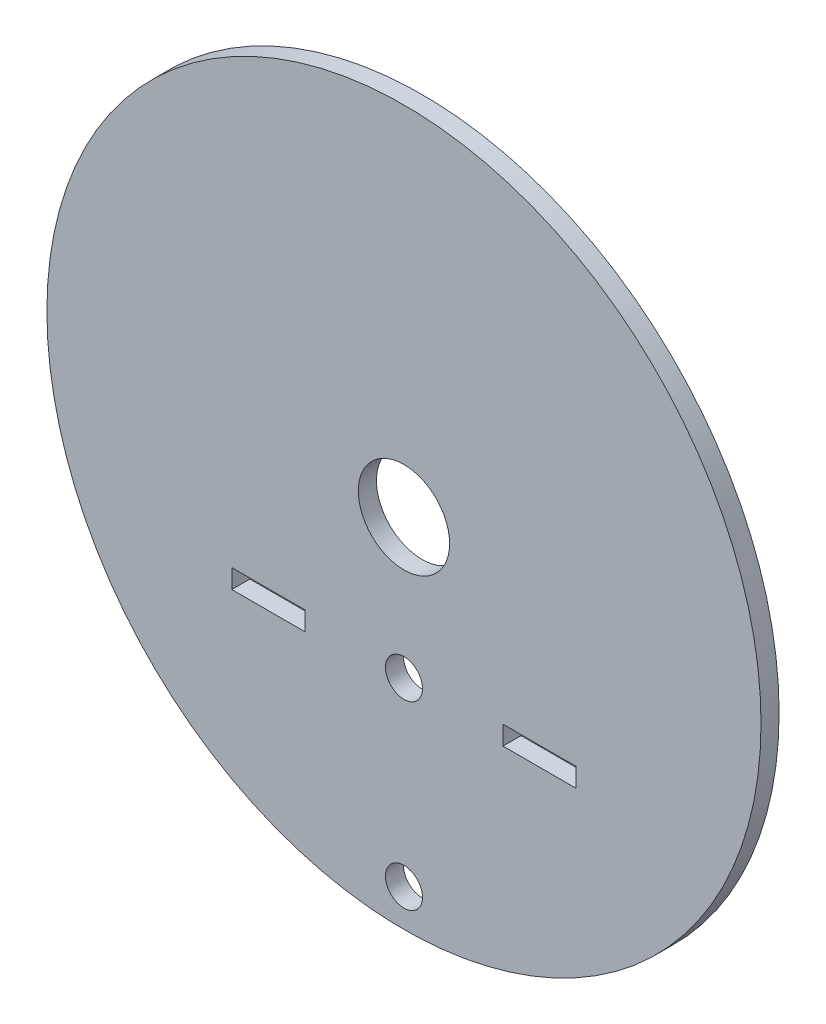
ISO-10303-21;
HEADER;
FILE_DESCRIPTION(('STEP AP214'),'2;1');
FILE_NAME('part.step','',(''),(''),'','','');
FILE_SCHEMA(('AUTOMOTIVE_DESIGN { 1 0 10303 214 1 1 1 1 }'));
ENDSEC;
DATA;
#1=APPLICATION_CONTEXT('core data for automotive mechanical design processes');
#2=APPLICATION_PROTOCOL_DEFINITION('international standard','automotive_design',2000,#1);
#3=PRODUCT_CONTEXT('',#1,'mechanical');
#4=PRODUCT('Part','Part','',(#3));
#5=PRODUCT_RELATED_PRODUCT_CATEGORY('part','',(#4));
#6=PRODUCT_DEFINITION_FORMATION('','',#4);
#7=PRODUCT_DEFINITION_CONTEXT('part definition',#1,'design');
#8=PRODUCT_DEFINITION('design','',#6,#7);
#9=PRODUCT_DEFINITION_SHAPE('','',#8);
#10=(LENGTH_UNIT() NAMED_UNIT(*) SI_UNIT(.MILLI.,.METRE.));
#11=(NAMED_UNIT(*) PLANE_ANGLE_UNIT() SI_UNIT($,.RADIAN.));
#12=(NAMED_UNIT(*) SI_UNIT($,.STERADIAN.) SOLID_ANGLE_UNIT());
#13=UNCERTAINTY_MEASURE_WITH_UNIT(LENGTH_MEASURE(1.E-05),#10,'distance_accuracy_value','');
#14=(GEOMETRIC_REPRESENTATION_CONTEXT(3) GLOBAL_UNCERTAINTY_ASSIGNED_CONTEXT((#13)) GLOBAL_UNIT_ASSIGNED_CONTEXT((#10,
#11,#12)) REPRESENTATION_CONTEXT('',''));
#15=CARTESIAN_POINT('',(0.,0.,0.));
#16=DIRECTION('',(0.,0.,1.));
#17=DIRECTION('',(1.,0.,0.));
#18=AXIS2_PLACEMENT_3D('',#15,#16,#17);
#19=CARTESIAN_POINT('',(0.,35.4,2.));
#20=DIRECTION('',(0.,0.,1.));
#21=DIRECTION('',(1.,0.,0.));
#22=AXIS2_PLACEMENT_3D('',#19,#20,#21);
#23=PLANE('',#22);
#24=DIRECTION('',(0.,-1.,0.));
#25=VECTOR('',#24,1.);
#26=CARTESIAN_POINT('',(10.95,21.05,2.));
#27=LINE('',#26,#25);
#28=CARTESIAN_POINT('',(10.95,21.05,2.));
#29=VERTEX_POINT('',#28);
#30=CARTESIAN_POINT('',(10.95,18.95,2.));
#31=VERTEX_POINT('',#30);
#32=EDGE_CURVE('E108',#29,#31,#27,.T.);
#33=ORIENTED_EDGE('',*,*,#32,.F.);
#34=DIRECTION('',(-1.,0.,0.));
#35=VECTOR('',#34,1.);
#36=CARTESIAN_POINT('',(19.05,21.05,2.));
#37=LINE('',#36,#35);
#38=CARTESIAN_POINT('',(19.05,21.05,2.));
#39=VERTEX_POINT('',#38);
#40=EDGE_CURVE('E100',#39,#29,#37,.T.);
#41=ORIENTED_EDGE('',*,*,#40,.F.);
#42=DIRECTION('',(0.,1.,0.));
#43=VECTOR('',#42,1.);
#44=CARTESIAN_POINT('',(19.05,21.05,2.));
#45=LINE('',#44,#43);
#46=CARTESIAN_POINT('',(19.05,18.95,2.));
#47=VERTEX_POINT('',#46);
#48=EDGE_CURVE('E123',#47,#39,#45,.T.);
#49=ORIENTED_EDGE('',*,*,#48,.F.);
#50=DIRECTION('',(1.,0.,0.));
#51=VECTOR('',#50,1.);
#52=CARTESIAN_POINT('',(19.05,18.95,2.));
#53=LINE('',#52,#51);
#54=EDGE_CURVE('E121',#31,#47,#53,.T.);
#55=ORIENTED_EDGE('',*,*,#54,.F.);
#56=EDGE_LOOP('',(#33,#41,#49,#55));
#57=FACE_BOUND('',#56,.T.);
#58=DIRECTION('',(-1.,0.,0.));
#59=VECTOR('',#58,1.);
#60=CARTESIAN_POINT('',(-19.05,21.05,2.));
#61=LINE('',#60,#59);
#62=CARTESIAN_POINT('',(-10.95,21.05,2.));
#63=VERTEX_POINT('',#62);
#64=CARTESIAN_POINT('',(-19.05,21.05,2.));
#65=VERTEX_POINT('',#64);
#66=EDGE_CURVE('E141',#63,#65,#61,.T.);
#67=ORIENTED_EDGE('',*,*,#66,.F.);
#68=DIRECTION('',(0.,1.,0.));
#69=VECTOR('',#68,1.);
#70=CARTESIAN_POINT('',(-10.95,21.05,2.));
#71=LINE('',#70,#69);
#72=CARTESIAN_POINT('',(-10.95,18.95,2.));
#73=VERTEX_POINT('',#72);
#74=EDGE_CURVE('E139',#73,#63,#71,.T.);
#75=ORIENTED_EDGE('',*,*,#74,.F.);
#76=DIRECTION('',(1.,0.,0.));
#77=VECTOR('',#76,1.);
#78=CARTESIAN_POINT('',(-19.05,18.95,2.));
#79=LINE('',#78,#77);
#80=CARTESIAN_POINT('',(-19.05,18.95,2.));
#81=VERTEX_POINT('',#80);
#82=EDGE_CURVE('E147',#81,#73,#79,.T.);
#83=ORIENTED_EDGE('',*,*,#82,.F.);
#84=DIRECTION('',(0.,-1.,0.));
#85=VECTOR('',#84,1.);
#86=CARTESIAN_POINT('',(-19.05,21.05,2.));
#87=LINE('',#86,#85);
#88=EDGE_CURVE('E144',#65,#81,#87,.T.);
#89=ORIENTED_EDGE('',*,*,#88,.F.);
#90=EDGE_LOOP('',(#67,#75,#83,#89));
#91=FACE_BOUND('',#90,.T.);
#92=CARTESIAN_POINT('',(0.,20.,2.));
#93=DIRECTION('',(0.,0.,1.));
#94=DIRECTION('',(1.,0.,0.));
#95=AXIS2_PLACEMENT_3D('',#92,#93,#94);
#96=CIRCLE('',#95,2.05);
#97=CARTESIAN_POINT('',(2.05,20.,2.));
#98=VERTEX_POINT('',#97);
#99=EDGE_CURVE('E170',#98,#98,#96,.T.);
#100=ORIENTED_EDGE('',*,*,#99,.F.);
#101=EDGE_LOOP('',(#100));
#102=FACE_BOUND('',#101,.T.);
#103=CARTESIAN_POINT('',(0.,35.4,2.));
#104=DIRECTION('',(0.,0.,1.));
#105=DIRECTION('',(1.,0.,0.));
#106=AXIS2_PLACEMENT_3D('',#103,#104,#105);
#107=CIRCLE('',#106,39.5);
#108=CARTESIAN_POINT('',(39.5,35.4,2.));
#109=VERTEX_POINT('',#108);
#110=EDGE_CURVE('E11',#109,#109,#107,.T.);
#111=ORIENTED_EDGE('',*,*,#110,.T.);
#112=EDGE_LOOP('',(#111));
#113=FACE_BOUND('',#112,.T.);
#114=CARTESIAN_POINT('',(0.,0.,2.));
#115=DIRECTION('',(0.,0.,1.));
#116=DIRECTION('',(1.,0.,0.));
#117=AXIS2_PLACEMENT_3D('',#114,#115,#116);
#118=CIRCLE('',#117,2.05);
#119=CARTESIAN_POINT('',(2.05,0.,2.));
#120=VERTEX_POINT('',#119);
#121=EDGE_CURVE('E176',#120,#120,#118,.T.);
#122=ORIENTED_EDGE('',*,*,#121,.F.);
#123=EDGE_LOOP('',(#122));
#124=FACE_BOUND('',#123,.T.);
#125=CARTESIAN_POINT('',(0.,35.4,2.));
#126=DIRECTION('',(0.,0.,1.));
#127=DIRECTION('',(1.,0.,0.));
#128=AXIS2_PLACEMENT_3D('',#125,#126,#127);
#129=CIRCLE('',#128,5.05);
#130=CARTESIAN_POINT('',(5.05,35.4,2.));
#131=VERTEX_POINT('',#130);
#132=EDGE_CURVE('E129',#131,#131,#129,.T.);
#133=ORIENTED_EDGE('',*,*,#132,.F.);
#134=EDGE_LOOP('',(#133));
#135=FACE_BOUND('',#134,.T.);
#136=ADVANCED_FACE('F35',(#57,#91,#102,#113,#124,#135),#23,.T.);
#137=CARTESIAN_POINT('',(0.,35.4,0.));
#138=DIRECTION('',(0.,0.,1.));
#139=DIRECTION('',(1.,0.,0.));
#140=AXIS2_PLACEMENT_3D('',#137,#138,#139);
#141=PLANE('',#140);
#142=DIRECTION('',(0.,1.,0.));
#143=VECTOR('',#142,1.);
#144=CARTESIAN_POINT('',(-10.95,21.05,0.));
#145=LINE('',#144,#143);
#146=CARTESIAN_POINT('',(-10.95,18.95,0.));
#147=VERTEX_POINT('',#146);
#148=CARTESIAN_POINT('',(-10.95,21.05,0.));
#149=VERTEX_POINT('',#148);
#150=EDGE_CURVE('E116',#147,#149,#145,.T.);
#151=ORIENTED_EDGE('',*,*,#150,.T.);
#152=DIRECTION('',(-1.,0.,0.));
#153=VECTOR('',#152,1.);
#154=CARTESIAN_POINT('',(-19.05,21.05,0.));
#155=LINE('',#154,#153);
#156=CARTESIAN_POINT('',(-19.05,21.05,0.));
#157=VERTEX_POINT('',#156);
#158=EDGE_CURVE('E152',#149,#157,#155,.T.);
#159=ORIENTED_EDGE('',*,*,#158,.T.);
#160=DIRECTION('',(0.,-1.,0.));
#161=VECTOR('',#160,1.);
#162=CARTESIAN_POINT('',(-19.05,21.05,0.));
#163=LINE('',#162,#161);
#164=CARTESIAN_POINT('',(-19.05,18.95,0.));
#165=VERTEX_POINT('',#164);
#166=EDGE_CURVE('E155',#157,#165,#163,.T.);
#167=ORIENTED_EDGE('',*,*,#166,.T.);
#168=DIRECTION('',(1.,0.,0.));
#169=VECTOR('',#168,1.);
#170=CARTESIAN_POINT('',(-19.05,18.95,0.));
#171=LINE('',#170,#169);
#172=EDGE_CURVE('E142',#165,#147,#171,.T.);
#173=ORIENTED_EDGE('',*,*,#172,.T.);
#174=EDGE_LOOP('',(#151,#159,#167,#173));
#175=FACE_BOUND('',#174,.T.);
#176=CARTESIAN_POINT('',(0.,35.4,0.));
#177=DIRECTION('',(0.,0.,1.));
#178=DIRECTION('',(1.,0.,0.));
#179=AXIS2_PLACEMENT_3D('',#176,#177,#178);
#180=CIRCLE('',#179,39.5);
#181=CARTESIAN_POINT('',(39.5,35.4,0.));
#182=VERTEX_POINT('',#181);
#183=EDGE_CURVE('E39',#182,#182,#180,.T.);
#184=ORIENTED_EDGE('',*,*,#183,.F.);
#185=EDGE_LOOP('',(#184));
#186=FACE_BOUND('',#185,.T.);
#187=CARTESIAN_POINT('',(0.,0.,0.));
#188=DIRECTION('',(0.,0.,1.));
#189=DIRECTION('',(1.,0.,0.));
#190=AXIS2_PLACEMENT_3D('',#187,#188,#189);
#191=CIRCLE('',#190,2.05);
#192=CARTESIAN_POINT('',(2.05,0.,0.));
#193=VERTEX_POINT('',#192);
#194=EDGE_CURVE('E173',#193,#193,#191,.T.);
#195=ORIENTED_EDGE('',*,*,#194,.T.);
#196=EDGE_LOOP('',(#195));
#197=FACE_BOUND('',#196,.T.);
#198=CARTESIAN_POINT('',(0.,20.,0.));
#199=DIRECTION('',(0.,0.,1.));
#200=DIRECTION('',(1.,0.,0.));
#201=AXIS2_PLACEMENT_3D('',#198,#199,#200);
#202=CIRCLE('',#201,2.05);
#203=CARTESIAN_POINT('',(2.05,20.,0.));
#204=VERTEX_POINT('',#203);
#205=EDGE_CURVE('E169',#204,#204,#202,.T.);
#206=ORIENTED_EDGE('',*,*,#205,.T.);
#207=EDGE_LOOP('',(#206));
#208=FACE_BOUND('',#207,.T.);
#209=DIRECTION('',(-1.,0.,0.));
#210=VECTOR('',#209,1.);
#211=CARTESIAN_POINT('',(19.05,21.05,0.));
#212=LINE('',#211,#210);
#213=CARTESIAN_POINT('',(19.05,21.05,0.));
#214=VERTEX_POINT('',#213);
#215=CARTESIAN_POINT('',(10.95,21.05,0.));
#216=VERTEX_POINT('',#215);
#217=EDGE_CURVE('E58',#214,#216,#212,.T.);
#218=ORIENTED_EDGE('',*,*,#217,.T.);
#219=DIRECTION('',(0.,-1.,0.));
#220=VECTOR('',#219,1.);
#221=CARTESIAN_POINT('',(10.95,21.05,0.));
#222=LINE('',#221,#220);
#223=CARTESIAN_POINT('',(10.95,18.95,0.));
#224=VERTEX_POINT('',#223);
#225=EDGE_CURVE('E115',#216,#224,#222,.T.);
#226=ORIENTED_EDGE('',*,*,#225,.T.);
#227=DIRECTION('',(1.,0.,0.));
#228=VECTOR('',#227,1.);
#229=CARTESIAN_POINT('',(19.05,18.95,0.));
#230=LINE('',#229,#228);
#231=CARTESIAN_POINT('',(19.05,18.95,0.));
#232=VERTEX_POINT('',#231);
#233=EDGE_CURVE('E131',#224,#232,#230,.T.);
#234=ORIENTED_EDGE('',*,*,#233,.T.);
#235=DIRECTION('',(0.,1.,0.));
#236=VECTOR('',#235,1.);
#237=CARTESIAN_POINT('',(19.05,21.05,0.));
#238=LINE('',#237,#236);
#239=EDGE_CURVE('E109',#232,#214,#238,.T.);
#240=ORIENTED_EDGE('',*,*,#239,.T.);
#241=EDGE_LOOP('',(#218,#226,#234,#240));
#242=FACE_BOUND('',#241,.T.);
#243=CARTESIAN_POINT('',(0.,35.4,0.));
#244=DIRECTION('',(0.,0.,1.));
#245=DIRECTION('',(1.,0.,0.));
#246=AXIS2_PLACEMENT_3D('',#243,#244,#245);
#247=CIRCLE('',#246,5.05);
#248=CARTESIAN_POINT('',(5.05,35.4,0.));
#249=VERTEX_POINT('',#248);
#250=EDGE_CURVE('E309',#249,#249,#247,.T.);
#251=ORIENTED_EDGE('',*,*,#250,.T.);
#252=EDGE_LOOP('',(#251));
#253=FACE_BOUND('',#252,.T.);
#254=ADVANCED_FACE('F182',(#175,#186,#197,#208,#242,#253),#141,.F.);
#255=CARTESIAN_POINT('',(0.,35.4,2.));
#256=DIRECTION('',(0.,0.,-1.));
#257=DIRECTION('',(-1.,0.,0.));
#258=AXIS2_PLACEMENT_3D('',#255,#256,#257);
#259=CYLINDRICAL_SURFACE('',#258,39.5);
#260=ORIENTED_EDGE('',*,*,#110,.F.);
#261=EDGE_LOOP('',(#260));
#262=FACE_BOUND('',#261,.T.);
#263=ORIENTED_EDGE('',*,*,#183,.T.);
#264=EDGE_LOOP('',(#263));
#265=FACE_BOUND('',#264,.T.);
#266=ADVANCED_FACE('F37',(#262,#265),#259,.T.);
#267=CARTESIAN_POINT('',(0.,0.,2.));
#268=DIRECTION('',(0.,0.,-1.));
#269=DIRECTION('',(-1.,0.,0.));
#270=AXIS2_PLACEMENT_3D('',#267,#268,#269);
#271=CYLINDRICAL_SURFACE('',#270,2.05);
#272=ORIENTED_EDGE('',*,*,#121,.T.);
#273=EDGE_LOOP('',(#272));
#274=FACE_BOUND('',#273,.T.);
#275=ORIENTED_EDGE('',*,*,#194,.F.);
#276=EDGE_LOOP('',(#275));
#277=FACE_BOUND('',#276,.T.);
#278=ADVANCED_FACE('F185',(#274,#277),#271,.F.);
#279=CARTESIAN_POINT('',(0.,20.,2.));
#280=DIRECTION('',(0.,0.,-1.));
#281=DIRECTION('',(-1.,0.,0.));
#282=AXIS2_PLACEMENT_3D('',#279,#280,#281);
#283=CYLINDRICAL_SURFACE('',#282,2.05);
#284=ORIENTED_EDGE('',*,*,#99,.T.);
#285=EDGE_LOOP('',(#284));
#286=FACE_BOUND('',#285,.T.);
#287=ORIENTED_EDGE('',*,*,#205,.F.);
#288=EDGE_LOOP('',(#287));
#289=FACE_BOUND('',#288,.T.);
#290=ADVANCED_FACE('F187',(#286,#289),#283,.F.);
#291=CARTESIAN_POINT('',(-10.95,21.05,2.));
#292=DIRECTION('',(-1.,0.,0.));
#293=DIRECTION('',(0.,0.,1.));
#294=AXIS2_PLACEMENT_3D('',#291,#292,#293);
#295=PLANE('',#294);
#296=ORIENTED_EDGE('',*,*,#150,.F.);
#297=DIRECTION('',(0.,0.,-1.));
#298=VECTOR('',#297,1.);
#299=CARTESIAN_POINT('',(-10.95,18.95,2.));
#300=LINE('',#299,#298);
#301=EDGE_CURVE('E149',#73,#147,#300,.T.);
#302=ORIENTED_EDGE('',*,*,#301,.F.);
#303=ORIENTED_EDGE('',*,*,#74,.T.);
#304=DIRECTION('',(0.,0.,-1.));
#305=VECTOR('',#304,1.);
#306=CARTESIAN_POINT('',(-10.95,21.05,2.));
#307=LINE('',#306,#305);
#308=EDGE_CURVE('E166',#63,#149,#307,.T.);
#309=ORIENTED_EDGE('',*,*,#308,.T.);
#310=EDGE_LOOP('',(#296,#302,#303,#309));
#311=FACE_BOUND('',#310,.T.);
#312=ADVANCED_FACE('F194',(#311),#295,.T.);
#313=CARTESIAN_POINT('',(-19.05,21.05,2.));
#314=DIRECTION('',(0.,-1.,0.));
#315=DIRECTION('',(0.,0.,-1.));
#316=AXIS2_PLACEMENT_3D('',#313,#314,#315);
#317=PLANE('',#316);
#318=ORIENTED_EDGE('',*,*,#158,.F.);
#319=ORIENTED_EDGE('',*,*,#308,.F.);
#320=ORIENTED_EDGE('',*,*,#66,.T.);
#321=DIRECTION('',(0.,0.,-1.));
#322=VECTOR('',#321,1.);
#323=CARTESIAN_POINT('',(-19.05,21.05,2.));
#324=LINE('',#323,#322);
#325=EDGE_CURVE('E164',#65,#157,#324,.T.);
#326=ORIENTED_EDGE('',*,*,#325,.T.);
#327=EDGE_LOOP('',(#318,#319,#320,#326));
#328=FACE_BOUND('',#327,.T.);
#329=ADVANCED_FACE('F222',(#328),#317,.T.);
#330=CARTESIAN_POINT('',(-19.05,21.05,2.));
#331=DIRECTION('',(1.,0.,0.));
#332=DIRECTION('',(0.,0.,-1.));
#333=AXIS2_PLACEMENT_3D('',#330,#331,#332);
#334=PLANE('',#333);
#335=ORIENTED_EDGE('',*,*,#166,.F.);
#336=ORIENTED_EDGE('',*,*,#325,.F.);
#337=ORIENTED_EDGE('',*,*,#88,.T.);
#338=DIRECTION('',(0.,0.,-1.));
#339=VECTOR('',#338,1.);
#340=CARTESIAN_POINT('',(-19.05,18.95,2.));
#341=LINE('',#340,#339);
#342=EDGE_CURVE('E162',#81,#165,#341,.T.);
#343=ORIENTED_EDGE('',*,*,#342,.T.);
#344=EDGE_LOOP('',(#335,#336,#337,#343));
#345=FACE_BOUND('',#344,.T.);
#346=ADVANCED_FACE('F226',(#345),#334,.T.);
#347=CARTESIAN_POINT('',(-19.05,18.95,2.));
#348=DIRECTION('',(0.,1.,0.));
#349=DIRECTION('',(0.,0.,1.));
#350=AXIS2_PLACEMENT_3D('',#347,#348,#349);
#351=PLANE('',#350);
#352=ORIENTED_EDGE('',*,*,#172,.F.);
#353=ORIENTED_EDGE('',*,*,#342,.F.);
#354=ORIENTED_EDGE('',*,*,#82,.T.);
#355=ORIENTED_EDGE('',*,*,#301,.T.);
#356=EDGE_LOOP('',(#352,#353,#354,#355));
#357=FACE_BOUND('',#356,.T.);
#358=ADVANCED_FACE('F216',(#357),#351,.T.);
#359=CARTESIAN_POINT('',(19.05,21.05,2.));
#360=DIRECTION('',(0.,-1.,0.));
#361=DIRECTION('',(0.,0.,-1.));
#362=AXIS2_PLACEMENT_3D('',#359,#360,#361);
#363=PLANE('',#362);
#364=ORIENTED_EDGE('',*,*,#217,.F.);
#365=DIRECTION('',(0.,0.,-1.));
#366=VECTOR('',#365,1.);
#367=CARTESIAN_POINT('',(19.05,21.05,2.));
#368=LINE('',#367,#366);
#369=EDGE_CURVE('E104',#39,#214,#368,.T.);
#370=ORIENTED_EDGE('',*,*,#369,.F.);
#371=ORIENTED_EDGE('',*,*,#40,.T.);
#372=DIRECTION('',(0.,0.,-1.));
#373=VECTOR('',#372,1.);
#374=CARTESIAN_POINT('',(10.95,21.05,2.));
#375=LINE('',#374,#373);
#376=EDGE_CURVE('E103',#29,#216,#375,.T.);
#377=ORIENTED_EDGE('',*,*,#376,.T.);
#378=EDGE_LOOP('',(#364,#370,#371,#377));
#379=FACE_BOUND('',#378,.T.);
#380=ADVANCED_FACE('F102',(#379),#363,.T.);
#381=CARTESIAN_POINT('',(10.95,21.05,2.));
#382=DIRECTION('',(1.,0.,0.));
#383=DIRECTION('',(0.,0.,-1.));
#384=AXIS2_PLACEMENT_3D('',#381,#382,#383);
#385=PLANE('',#384);
#386=ORIENTED_EDGE('',*,*,#225,.F.);
#387=ORIENTED_EDGE('',*,*,#376,.F.);
#388=ORIENTED_EDGE('',*,*,#32,.T.);
#389=DIRECTION('',(0.,0.,-1.));
#390=VECTOR('',#389,1.);
#391=CARTESIAN_POINT('',(10.95,18.95,2.));
#392=LINE('',#391,#390);
#393=EDGE_CURVE('E117',#31,#224,#392,.T.);
#394=ORIENTED_EDGE('',*,*,#393,.T.);
#395=EDGE_LOOP('',(#386,#387,#388,#394));
#396=FACE_BOUND('',#395,.T.);
#397=ADVANCED_FACE('F112',(#396),#385,.T.);
#398=CARTESIAN_POINT('',(19.05,18.95,2.));
#399=DIRECTION('',(0.,1.,0.));
#400=DIRECTION('',(0.,0.,1.));
#401=AXIS2_PLACEMENT_3D('',#398,#399,#400);
#402=PLANE('',#401);
#403=ORIENTED_EDGE('',*,*,#233,.F.);
#404=ORIENTED_EDGE('',*,*,#393,.F.);
#405=ORIENTED_EDGE('',*,*,#54,.T.);
#406=DIRECTION('',(0.,0.,-1.));
#407=VECTOR('',#406,1.);
#408=CARTESIAN_POINT('',(19.05,18.95,2.));
#409=LINE('',#408,#407);
#410=EDGE_CURVE('E50',#47,#232,#409,.T.);
#411=ORIENTED_EDGE('',*,*,#410,.T.);
#412=EDGE_LOOP('',(#403,#404,#405,#411));
#413=FACE_BOUND('',#412,.T.);
#414=ADVANCED_FACE('F272',(#413),#402,.T.);
#415=CARTESIAN_POINT('',(19.05,21.05,2.));
#416=DIRECTION('',(-1.,0.,0.));
#417=DIRECTION('',(0.,0.,1.));
#418=AXIS2_PLACEMENT_3D('',#415,#416,#417);
#419=PLANE('',#418);
#420=ORIENTED_EDGE('',*,*,#239,.F.);
#421=ORIENTED_EDGE('',*,*,#410,.F.);
#422=ORIENTED_EDGE('',*,*,#48,.T.);
#423=ORIENTED_EDGE('',*,*,#369,.T.);
#424=EDGE_LOOP('',(#420,#421,#422,#423));
#425=FACE_BOUND('',#424,.T.);
#426=ADVANCED_FACE('F281',(#425),#419,.T.);
#427=CARTESIAN_POINT('',(0.,35.4,2.));
#428=DIRECTION('',(0.,0.,-1.));
#429=DIRECTION('',(-1.,0.,0.));
#430=AXIS2_PLACEMENT_3D('',#427,#428,#429);
#431=CYLINDRICAL_SURFACE('',#430,5.05);
#432=ORIENTED_EDGE('',*,*,#132,.T.);
#433=EDGE_LOOP('',(#432));
#434=FACE_BOUND('',#433,.T.);
#435=ORIENTED_EDGE('',*,*,#250,.F.);
#436=EDGE_LOOP('',(#435));
#437=FACE_BOUND('',#436,.T.);
#438=ADVANCED_FACE('F291',(#434,#437),#431,.F.);
#439=CLOSED_SHELL('',(#136,#254,#266,#278,#290,#312,#329,#346,#358,#380,#397,#414,#426,#438));
#440=MANIFOLD_SOLID_BREP('B2',#439);
#441=ADVANCED_BREP_SHAPE_REPRESENTATION('',(#18,#440),#14);
#442=SHAPE_DEFINITION_REPRESENTATION(#9,#441);
ENDSEC;
END-ISO-10303-21;
